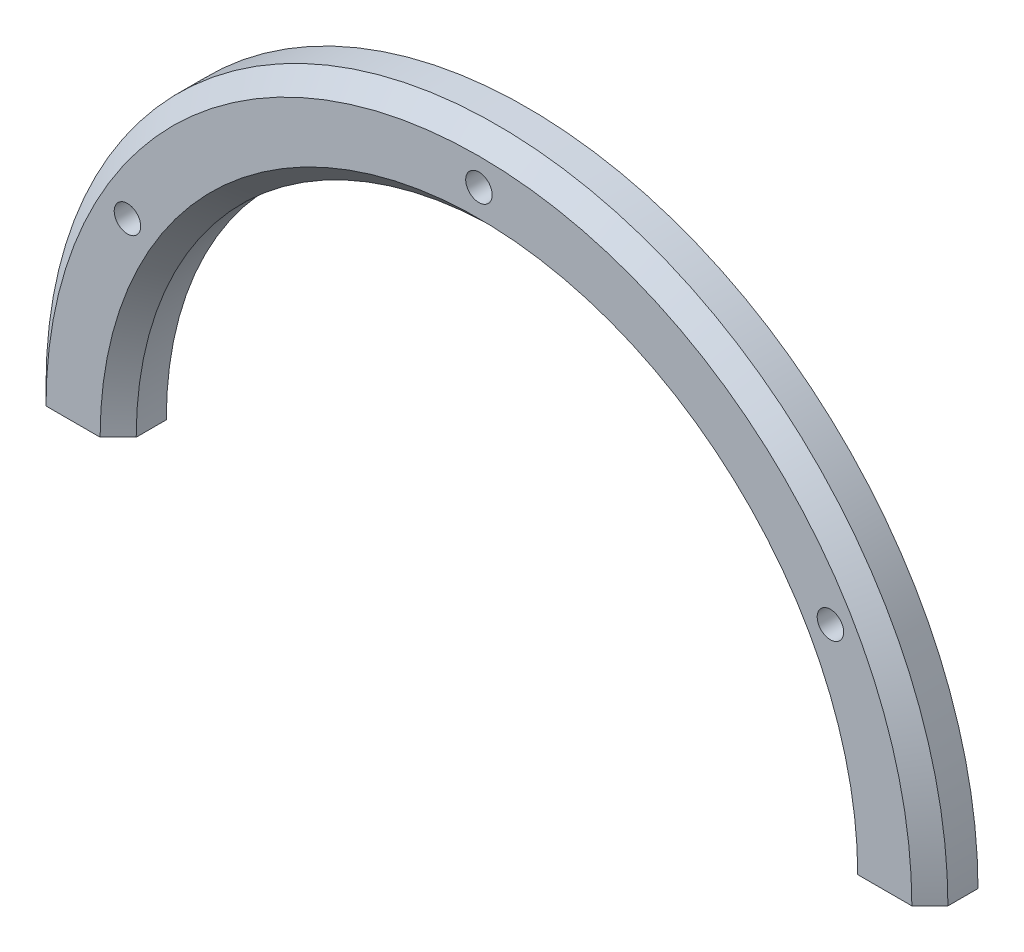
ISO-10303-21;
HEADER;
FILE_DESCRIPTION(('STEP AP214'),'2;1');
FILE_NAME('part.step','',(''),(''),'','','');
FILE_SCHEMA(('AUTOMOTIVE_DESIGN { 1 0 10303 214 1 1 1 1 }'));
ENDSEC;
DATA;
#1=APPLICATION_CONTEXT('core data for automotive mechanical design processes');
#2=APPLICATION_PROTOCOL_DEFINITION('international standard','automotive_design',2000,#1);
#3=PRODUCT_CONTEXT('',#1,'mechanical');
#4=PRODUCT('Part','Part','',(#3));
#5=PRODUCT_RELATED_PRODUCT_CATEGORY('part','',(#4));
#6=PRODUCT_DEFINITION_FORMATION('','',#4);
#7=PRODUCT_DEFINITION_CONTEXT('part definition',#1,'design');
#8=PRODUCT_DEFINITION('design','',#6,#7);
#9=PRODUCT_DEFINITION_SHAPE('','',#8);
#10=(LENGTH_UNIT() NAMED_UNIT(*) SI_UNIT(.MILLI.,.METRE.));
#11=(NAMED_UNIT(*) PLANE_ANGLE_UNIT() SI_UNIT($,.RADIAN.));
#12=(NAMED_UNIT(*) SI_UNIT($,.STERADIAN.) SOLID_ANGLE_UNIT());
#13=UNCERTAINTY_MEASURE_WITH_UNIT(LENGTH_MEASURE(1.E-05),#10,'distance_accuracy_value','');
#14=(GEOMETRIC_REPRESENTATION_CONTEXT(3) GLOBAL_UNCERTAINTY_ASSIGNED_CONTEXT((#13)) GLOBAL_UNIT_ASSIGNED_CONTEXT((#10,
#11,#12)) REPRESENTATION_CONTEXT('',''));
#15=CARTESIAN_POINT('',(0.,0.,0.));
#16=DIRECTION('',(0.,0.,1.));
#17=DIRECTION('',(1.,0.,0.));
#18=AXIS2_PLACEMENT_3D('',#15,#16,#17);
#19=CARTESIAN_POINT('',(0.,0.,8.));
#20=DIRECTION('',(0.,0.,1.));
#21=DIRECTION('',(1.,0.,0.));
#22=AXIS2_PLACEMENT_3D('',#19,#20,#21);
#23=PLANE('',#22);
#24=CARTESIAN_POINT('',(-58.4567147554497,33.7499999999999,8.));
#25=DIRECTION('',(0.,0.,1.));
#26=DIRECTION('',(1.,0.,0.));
#27=AXIS2_PLACEMENT_3D('',#24,#25,#26);
#28=CIRCLE('',#27,2.2);
#29=CARTESIAN_POINT('',(-56.2567147554497,33.7499999999999,8.));
#30=VERTEX_POINT('',#29);
#31=EDGE_CURVE('E244',#30,#30,#28,.T.);
#32=ORIENTED_EDGE('',*,*,#31,.F.);
#33=EDGE_LOOP('',(#32));
#34=FACE_BOUND('',#33,.T.);
#35=DIRECTION('',(1.,0.,0.));
#36=VECTOR('',#35,1.);
#37=CARTESIAN_POINT('',(-75.,0.,8.));
#38=LINE('',#37,#36);
#39=CARTESIAN_POINT('',(-72.,0.,8.));
#40=VERTEX_POINT('',#39);
#41=CARTESIAN_POINT('',(-63.,0.,8.));
#42=VERTEX_POINT('',#41);
#43=EDGE_CURVE('E115',#40,#42,#38,.T.);
#44=ORIENTED_EDGE('',*,*,#43,.T.);
#45=CARTESIAN_POINT('',(0.,0.,8.));
#46=DIRECTION('',(0.,0.,1.));
#47=DIRECTION('',(1.,0.,0.));
#48=AXIS2_PLACEMENT_3D('',#45,#46,#47);
#49=CIRCLE('',#48,63.);
#50=CARTESIAN_POINT('',(63.,0.,8.));
#51=VERTEX_POINT('',#50);
#52=EDGE_CURVE('E128',#42,#51,#49,.F.);
#53=ORIENTED_EDGE('',*,*,#52,.T.);
#54=DIRECTION('',(1.,0.,0.));
#55=VECTOR('',#54,1.);
#56=CARTESIAN_POINT('',(60.,0.,8.));
#57=LINE('',#56,#55);
#58=CARTESIAN_POINT('',(72.,0.,8.));
#59=VERTEX_POINT('',#58);
#60=EDGE_CURVE('E121',#51,#59,#57,.T.);
#61=ORIENTED_EDGE('',*,*,#60,.T.);
#62=CARTESIAN_POINT('',(0.,0.,8.));
#63=DIRECTION('',(0.,0.,1.));
#64=DIRECTION('',(1.,0.,0.));
#65=AXIS2_PLACEMENT_3D('',#62,#63,#64);
#66=CIRCLE('',#65,72.);
#67=EDGE_CURVE('E94',#59,#40,#66,.T.);
#68=ORIENTED_EDGE('',*,*,#67,.T.);
#69=EDGE_LOOP('',(#44,#53,#61,#68));
#70=FACE_BOUND('',#69,.T.);
#71=CARTESIAN_POINT('',(0.,67.5,8.));
#72=DIRECTION('',(0.,0.,1.));
#73=DIRECTION('',(1.,0.,0.));
#74=AXIS2_PLACEMENT_3D('',#71,#72,#73);
#75=CIRCLE('',#74,2.2);
#76=CARTESIAN_POINT('',(2.2,67.5,8.));
#77=VERTEX_POINT('',#76);
#78=EDGE_CURVE('E109',#77,#77,#75,.T.);
#79=ORIENTED_EDGE('',*,*,#78,.F.);
#80=EDGE_LOOP('',(#79));
#81=FACE_BOUND('',#80,.T.);
#82=CARTESIAN_POINT('',(58.4567147554492,33.7500000000007,8.));
#83=DIRECTION('',(0.,0.,1.));
#84=DIRECTION('',(1.,0.,0.));
#85=AXIS2_PLACEMENT_3D('',#82,#83,#84);
#86=CIRCLE('',#85,2.2);
#87=CARTESIAN_POINT('',(60.6567147554492,33.7500000000007,8.));
#88=VERTEX_POINT('',#87);
#89=EDGE_CURVE('E249',#88,#88,#86,.T.);
#90=ORIENTED_EDGE('',*,*,#89,.F.);
#91=EDGE_LOOP('',(#90));
#92=FACE_BOUND('',#91,.T.);
#93=ADVANCED_FACE('F33',(#34,#70,#81,#92),#23,.T.);
#94=CARTESIAN_POINT('',(0.,0.,0.));
#95=DIRECTION('',(0.,0.,1.));
#96=DIRECTION('',(1.,0.,0.));
#97=AXIS2_PLACEMENT_3D('',#94,#95,#96);
#98=PLANE('',#97);
#99=CARTESIAN_POINT('',(0.,0.,0.));
#100=DIRECTION('',(0.,0.,-1.));
#101=DIRECTION('',(1.,0.,0.));
#102=AXIS2_PLACEMENT_3D('',#99,#100,#101);
#103=CIRCLE('',#102,60.);
#104=CARTESIAN_POINT('',(-60.,0.,0.));
#105=VERTEX_POINT('',#104);
#106=CARTESIAN_POINT('',(60.,0.,0.));
#107=VERTEX_POINT('',#106);
#108=EDGE_CURVE('E102',#105,#107,#103,.T.);
#109=ORIENTED_EDGE('',*,*,#108,.F.);
#110=DIRECTION('',(1.,0.,0.));
#111=VECTOR('',#110,1.);
#112=CARTESIAN_POINT('',(-75.,0.,0.));
#113=LINE('',#112,#111);
#114=CARTESIAN_POINT('',(-75.,0.,0.));
#115=VERTEX_POINT('',#114);
#116=EDGE_CURVE('E119',#115,#105,#113,.T.);
#117=ORIENTED_EDGE('',*,*,#116,.F.);
#118=CARTESIAN_POINT('',(0.,0.,0.));
#119=DIRECTION('',(0.,0.,1.));
#120=DIRECTION('',(1.,0.,0.));
#121=AXIS2_PLACEMENT_3D('',#118,#119,#120);
#122=CIRCLE('',#121,75.);
#123=CARTESIAN_POINT('',(75.,0.,0.));
#124=VERTEX_POINT('',#123);
#125=EDGE_CURVE('E104',#124,#115,#122,.T.);
#126=ORIENTED_EDGE('',*,*,#125,.F.);
#127=DIRECTION('',(1.,0.,0.));
#128=VECTOR('',#127,1.);
#129=CARTESIAN_POINT('',(60.,0.,0.));
#130=LINE('',#129,#128);
#131=EDGE_CURVE('E90',#107,#124,#130,.T.);
#132=ORIENTED_EDGE('',*,*,#131,.F.);
#133=EDGE_LOOP('',(#109,#117,#126,#132));
#134=FACE_BOUND('',#133,.T.);
#135=CARTESIAN_POINT('',(0.,67.5,0.));
#136=DIRECTION('',(0.,0.,1.));
#137=DIRECTION('',(1.,0.,0.));
#138=AXIS2_PLACEMENT_3D('',#135,#136,#137);
#139=CIRCLE('',#138,2.2);
#140=CARTESIAN_POINT('',(2.2,67.5,0.));
#141=VERTEX_POINT('',#140);
#142=EDGE_CURVE('E112',#141,#141,#139,.T.);
#143=ORIENTED_EDGE('',*,*,#142,.T.);
#144=EDGE_LOOP('',(#143));
#145=FACE_BOUND('',#144,.T.);
#146=CARTESIAN_POINT('',(-58.4567147554497,33.7499999999999,0.));
#147=DIRECTION('',(0.,0.,1.));
#148=DIRECTION('',(1.,0.,0.));
#149=AXIS2_PLACEMENT_3D('',#146,#147,#148);
#150=CIRCLE('',#149,2.2);
#151=CARTESIAN_POINT('',(-56.2567147554497,33.7499999999999,0.));
#152=VERTEX_POINT('',#151);
#153=EDGE_CURVE('E247',#152,#152,#150,.T.);
#154=ORIENTED_EDGE('',*,*,#153,.T.);
#155=EDGE_LOOP('',(#154));
#156=FACE_BOUND('',#155,.T.);
#157=CARTESIAN_POINT('',(58.4567147554492,33.7500000000007,0.));
#158=DIRECTION('',(0.,0.,1.));
#159=DIRECTION('',(1.,0.,0.));
#160=AXIS2_PLACEMENT_3D('',#157,#158,#159);
#161=CIRCLE('',#160,2.2);
#162=CARTESIAN_POINT('',(60.6567147554492,33.7500000000007,0.));
#163=VERTEX_POINT('',#162);
#164=EDGE_CURVE('E253',#163,#163,#161,.T.);
#165=ORIENTED_EDGE('',*,*,#164,.T.);
#166=EDGE_LOOP('',(#165));
#167=FACE_BOUND('',#166,.T.);
#168=ADVANCED_FACE('F99',(#134,#145,#156,#167),#98,.F.);
#169=CARTESIAN_POINT('',(0.,0.,8.));
#170=DIRECTION('',(0.,0.,-1.));
#171=DIRECTION('',(-1.,0.,0.));
#172=AXIS2_PLACEMENT_3D('',#169,#170,#171);
#173=CYLINDRICAL_SURFACE('',#172,60.);
#174=DIRECTION('',(0.,0.,-1.));
#175=VECTOR('',#174,1.);
#176=CARTESIAN_POINT('',(60.,0.,8.));
#177=LINE('',#176,#175);
#178=CARTESIAN_POINT('',(60.,0.,4.99999999999998));
#179=VERTEX_POINT('',#178);
#180=EDGE_CURVE('E85',#179,#107,#177,.T.);
#181=ORIENTED_EDGE('',*,*,#180,.F.);
#182=CARTESIAN_POINT('',(0.,0.,4.99999999999998));
#183=DIRECTION('',(0.,0.,1.));
#184=DIRECTION('',(1.,0.,0.));
#185=AXIS2_PLACEMENT_3D('',#182,#183,#184);
#186=CIRCLE('',#185,60.);
#187=CARTESIAN_POINT('',(-60.,0.,4.99999999999998));
#188=VERTEX_POINT('',#187);
#189=EDGE_CURVE('E56',#179,#188,#186,.T.);
#190=ORIENTED_EDGE('',*,*,#189,.T.);
#191=DIRECTION('',(0.,0.,-1.));
#192=VECTOR('',#191,1.);
#193=CARTESIAN_POINT('',(-60.,0.,8.));
#194=LINE('',#193,#192);
#195=EDGE_CURVE('E107',#188,#105,#194,.T.);
#196=ORIENTED_EDGE('',*,*,#195,.T.);
#197=ORIENTED_EDGE('',*,*,#108,.T.);
#198=EDGE_LOOP('',(#181,#190,#196,#197));
#199=FACE_BOUND('',#198,.T.);
#200=ADVANCED_FACE('F106',(#199),#173,.F.);
#201=CARTESIAN_POINT('',(60.,0.,8.));
#202=DIRECTION('',(0.,1.,0.));
#203=DIRECTION('',(0.,0.,1.));
#204=AXIS2_PLACEMENT_3D('',#201,#202,#203);
#205=PLANE('',#204);
#206=ORIENTED_EDGE('',*,*,#60,.F.);
#207=DIRECTION('',(-0.707106781186544,0.,-0.707106781186551));
#208=VECTOR('',#207,1.);
#209=CARTESIAN_POINT('',(0.,0.,-55.0000000000006));
#210=LINE('',#209,#208);
#211=EDGE_CURVE('E92',#51,#179,#210,.T.);
#212=ORIENTED_EDGE('',*,*,#211,.T.);
#213=ORIENTED_EDGE('',*,*,#180,.T.);
#214=ORIENTED_EDGE('',*,*,#131,.T.);
#215=DIRECTION('',(0.,0.,-1.));
#216=VECTOR('',#215,1.);
#217=CARTESIAN_POINT('',(75.,0.,8.));
#218=LINE('',#217,#216);
#219=CARTESIAN_POINT('',(75.,0.,5.));
#220=VERTEX_POINT('',#219);
#221=EDGE_CURVE('E95',#220,#124,#218,.T.);
#222=ORIENTED_EDGE('',*,*,#221,.F.);
#223=DIRECTION('',(0.707106781186548,0.,-0.707106781186547));
#224=VECTOR('',#223,1.);
#225=CARTESIAN_POINT('',(0.,0.,80.));
#226=LINE('',#225,#224);
#227=EDGE_CURVE('E131',#220,#59,#226,.F.);
#228=ORIENTED_EDGE('',*,*,#227,.T.);
#229=EDGE_LOOP('',(#206,#212,#213,#214,#222,#228));
#230=FACE_BOUND('',#229,.T.);
#231=ADVANCED_FACE('F88',(#230),#205,.F.);
#232=CARTESIAN_POINT('',(0.,0.,8.));
#233=DIRECTION('',(0.,0.,-1.));
#234=DIRECTION('',(-1.,0.,0.));
#235=AXIS2_PLACEMENT_3D('',#232,#233,#234);
#236=CYLINDRICAL_SURFACE('',#235,75.);
#237=DIRECTION('',(0.,0.,-1.));
#238=VECTOR('',#237,1.);
#239=CARTESIAN_POINT('',(-75.,0.,8.));
#240=LINE('',#239,#238);
#241=CARTESIAN_POINT('',(-75.,0.,5.));
#242=VERTEX_POINT('',#241);
#243=EDGE_CURVE('E123',#242,#115,#240,.T.);
#244=ORIENTED_EDGE('',*,*,#243,.F.);
#245=CARTESIAN_POINT('',(0.,0.,5.));
#246=DIRECTION('',(0.,0.,1.));
#247=DIRECTION('',(1.,0.,0.));
#248=AXIS2_PLACEMENT_3D('',#245,#246,#247);
#249=CIRCLE('',#248,75.);
#250=EDGE_CURVE('E11',#242,#220,#249,.F.);
#251=ORIENTED_EDGE('',*,*,#250,.T.);
#252=ORIENTED_EDGE('',*,*,#221,.T.);
#253=ORIENTED_EDGE('',*,*,#125,.T.);
#254=EDGE_LOOP('',(#244,#251,#252,#253));
#255=FACE_BOUND('',#254,.T.);
#256=ADVANCED_FACE('F170',(#255),#236,.T.);
#257=CARTESIAN_POINT('',(-75.,0.,8.));
#258=DIRECTION('',(0.,1.,0.));
#259=DIRECTION('',(0.,0.,1.));
#260=AXIS2_PLACEMENT_3D('',#257,#258,#259);
#261=PLANE('',#260);
#262=ORIENTED_EDGE('',*,*,#195,.F.);
#263=DIRECTION('',(-0.707106781186544,0.,0.707106781186551));
#264=VECTOR('',#263,1.);
#265=CARTESIAN_POINT('',(0.,0.,-55.0000000000006));
#266=LINE('',#265,#264);
#267=EDGE_CURVE('E41',#188,#42,#266,.T.);
#268=ORIENTED_EDGE('',*,*,#267,.T.);
#269=ORIENTED_EDGE('',*,*,#43,.F.);
#270=DIRECTION('',(0.707106781186548,0.,0.707106781186547));
#271=VECTOR('',#270,1.);
#272=CARTESIAN_POINT('',(0.,0.,80.));
#273=LINE('',#272,#271);
#274=EDGE_CURVE('E48',#40,#242,#273,.F.);
#275=ORIENTED_EDGE('',*,*,#274,.T.);
#276=ORIENTED_EDGE('',*,*,#243,.T.);
#277=ORIENTED_EDGE('',*,*,#116,.T.);
#278=EDGE_LOOP('',(#262,#268,#269,#275,#276,#277));
#279=FACE_BOUND('',#278,.T.);
#280=ADVANCED_FACE('F137',(#279),#261,.F.);
#281=CARTESIAN_POINT('',(0.,67.5,8.));
#282=DIRECTION('',(0.,0.,-1.));
#283=DIRECTION('',(-1.,0.,0.));
#284=AXIS2_PLACEMENT_3D('',#281,#282,#283);
#285=CYLINDRICAL_SURFACE('',#284,2.2);
#286=ORIENTED_EDGE('',*,*,#78,.T.);
#287=EDGE_LOOP('',(#286));
#288=FACE_BOUND('',#287,.T.);
#289=ORIENTED_EDGE('',*,*,#142,.F.);
#290=EDGE_LOOP('',(#289));
#291=FACE_BOUND('',#290,.T.);
#292=ADVANCED_FACE('F165',(#288,#291),#285,.F.);
#293=CARTESIAN_POINT('',(-58.4567147554497,33.7499999999999,8.));
#294=DIRECTION('',(0.,0.,-1.));
#295=DIRECTION('',(-1.,0.,0.));
#296=AXIS2_PLACEMENT_3D('',#293,#294,#295);
#297=CYLINDRICAL_SURFACE('',#296,2.2);
#298=ORIENTED_EDGE('',*,*,#31,.T.);
#299=EDGE_LOOP('',(#298));
#300=FACE_BOUND('',#299,.T.);
#301=ORIENTED_EDGE('',*,*,#153,.F.);
#302=EDGE_LOOP('',(#301));
#303=FACE_BOUND('',#302,.T.);
#304=ADVANCED_FACE('F152',(#300,#303),#297,.F.);
#305=CARTESIAN_POINT('',(58.4567147554492,33.7500000000007,8.));
#306=DIRECTION('',(0.,0.,-1.));
#307=DIRECTION('',(-1.,0.,0.));
#308=AXIS2_PLACEMENT_3D('',#305,#306,#307);
#309=CYLINDRICAL_SURFACE('',#308,2.2);
#310=ORIENTED_EDGE('',*,*,#89,.T.);
#311=EDGE_LOOP('',(#310));
#312=FACE_BOUND('',#311,.T.);
#313=ORIENTED_EDGE('',*,*,#164,.F.);
#314=EDGE_LOOP('',(#313));
#315=FACE_BOUND('',#314,.T.);
#316=ADVANCED_FACE('F146',(#312,#315),#309,.F.);
#317=CARTESIAN_POINT('',(0.,0.,8.));
#318=DIRECTION('',(0.,0.,1.));
#319=DIRECTION('',(1.,0.,0.));
#320=AXIS2_PLACEMENT_3D('',#317,#318,#319);
#321=CONICAL_SURFACE('',#320,63.,0.785398163397444);
#322=ORIENTED_EDGE('',*,*,#267,.F.);
#323=ORIENTED_EDGE('',*,*,#189,.F.);
#324=ORIENTED_EDGE('',*,*,#211,.F.);
#325=ORIENTED_EDGE('',*,*,#52,.F.);
#326=EDGE_LOOP('',(#322,#323,#324,#325));
#327=FACE_BOUND('',#326,.T.);
#328=ADVANCED_FACE('F144',(#327),#321,.F.);
#329=CARTESIAN_POINT('',(0.,0.,8.));
#330=DIRECTION('',(0.,0.,-1.));
#331=DIRECTION('',(-1.,0.,0.));
#332=AXIS2_PLACEMENT_3D('',#329,#330,#331);
#333=CONICAL_SURFACE('',#332,72.,0.785398163397448);
#334=ORIENTED_EDGE('',*,*,#227,.F.);
#335=ORIENTED_EDGE('',*,*,#250,.F.);
#336=ORIENTED_EDGE('',*,*,#274,.F.);
#337=ORIENTED_EDGE('',*,*,#67,.F.);
#338=EDGE_LOOP('',(#334,#335,#336,#337));
#339=FACE_BOUND('',#338,.T.);
#340=ADVANCED_FACE('F35',(#339),#333,.T.);
#341=CLOSED_SHELL('',(#93,#168,#200,#231,#256,#280,#292,#304,#316,#328,#340));
#342=MANIFOLD_SOLID_BREP('B2',#341);
#343=ADVANCED_BREP_SHAPE_REPRESENTATION('',(#18,#342),#14);
#344=SHAPE_DEFINITION_REPRESENTATION(#9,#343);
ENDSEC;
END-ISO-10303-21;
